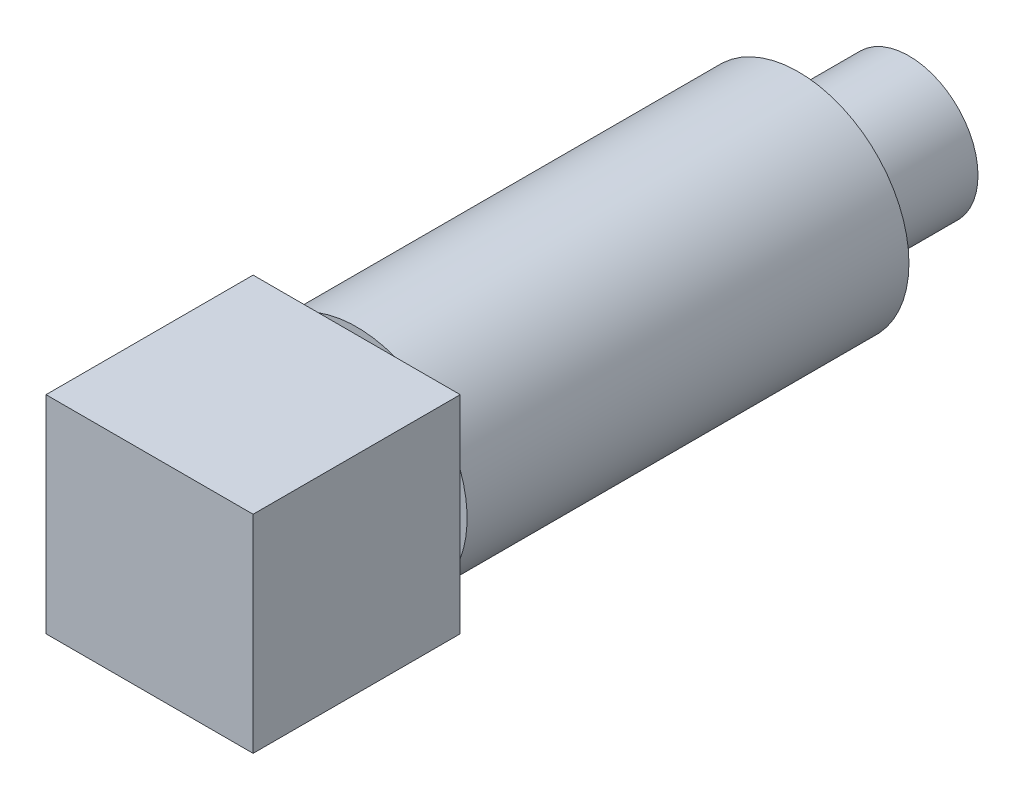
ISO-10303-21;
HEADER;
FILE_DESCRIPTION(('STEP AP214'),'2;1');
FILE_NAME('part.step','',(''),(''),'','','');
FILE_SCHEMA(('AUTOMOTIVE_DESIGN { 1 0 10303 214 1 1 1 1 }'));
ENDSEC;
DATA;
#1=APPLICATION_CONTEXT('core data for automotive mechanical design processes');
#2=APPLICATION_PROTOCOL_DEFINITION('international standard','automotive_design',2000,#1);
#3=PRODUCT_CONTEXT('',#1,'mechanical');
#4=PRODUCT('Part','Part','',(#3));
#5=PRODUCT_RELATED_PRODUCT_CATEGORY('part','',(#4));
#6=PRODUCT_DEFINITION_FORMATION('','',#4);
#7=PRODUCT_DEFINITION_CONTEXT('part definition',#1,'design');
#8=PRODUCT_DEFINITION('design','',#6,#7);
#9=PRODUCT_DEFINITION_SHAPE('','',#8);
#10=(LENGTH_UNIT() NAMED_UNIT(*) SI_UNIT(.MILLI.,.METRE.));
#11=(NAMED_UNIT(*) PLANE_ANGLE_UNIT() SI_UNIT($,.RADIAN.));
#12=(NAMED_UNIT(*) SI_UNIT($,.STERADIAN.) SOLID_ANGLE_UNIT());
#13=UNCERTAINTY_MEASURE_WITH_UNIT(LENGTH_MEASURE(1.E-05),#10,'distance_accuracy_value','');
#14=(GEOMETRIC_REPRESENTATION_CONTEXT(3) GLOBAL_UNCERTAINTY_ASSIGNED_CONTEXT((#13)) GLOBAL_UNIT_ASSIGNED_CONTEXT((#10,
#11,#12)) REPRESENTATION_CONTEXT('',''));
#15=CARTESIAN_POINT('',(0.,0.,0.));
#16=DIRECTION('',(0.,0.,1.));
#17=DIRECTION('',(1.,0.,0.));
#18=AXIS2_PLACEMENT_3D('',#15,#16,#17);
#19=CARTESIAN_POINT('',(0.,0.,40.));
#20=DIRECTION('',(0.,0.,1.));
#21=DIRECTION('',(1.,0.,0.));
#22=AXIS2_PLACEMENT_3D('',#19,#20,#21);
#23=PLANE('',#22);
#24=DIRECTION('',(0.,-1.,0.));
#25=VECTOR('',#24,1.);
#26=CARTESIAN_POINT('',(-7.5,7.5,40.));
#27=LINE('',#26,#25);
#28=CARTESIAN_POINT('',(-7.5,2.78388218141501,40.));
#29=VERTEX_POINT('',#28);
#30=CARTESIAN_POINT('',(-7.5,-2.78388218141501,40.));
#31=VERTEX_POINT('',#30);
#32=EDGE_CURVE('E11',#29,#31,#27,.T.);
#33=ORIENTED_EDGE('',*,*,#32,.F.);
#34=CARTESIAN_POINT('',(0.,0.,40.));
#35=DIRECTION('',(0.,0.,1.));
#36=DIRECTION('',(1.,0.,0.));
#37=AXIS2_PLACEMENT_3D('',#34,#35,#36);
#38=CIRCLE('',#37,8.);
#39=EDGE_CURVE('E361',#29,#31,#38,.T.);
#40=ORIENTED_EDGE('',*,*,#39,.T.);
#41=EDGE_LOOP('',(#33,#40));
#42=FACE_BOUND('',#41,.T.);
#43=ADVANCED_FACE('F41',(#42),#23,.T.);
#44=DIRECTION('',(-1.,0.,0.));
#45=VECTOR('',#44,1.);
#46=CARTESIAN_POINT('',(7.5,7.5,40.));
#47=LINE('',#46,#45);
#48=CARTESIAN_POINT('',(2.78388218141501,7.5,40.));
#49=VERTEX_POINT('',#48);
#50=CARTESIAN_POINT('',(-2.78388218141501,7.5,40.));
#51=VERTEX_POINT('',#50);
#52=EDGE_CURVE('E50',#49,#51,#47,.T.);
#53=ORIENTED_EDGE('',*,*,#52,.F.);
#54=EDGE_CURVE('E147',#49,#51,#38,.T.);
#55=ORIENTED_EDGE('',*,*,#54,.T.);
#56=EDGE_LOOP('',(#53,#55));
#57=FACE_BOUND('',#56,.T.);
#58=ADVANCED_FACE('F172',(#57),#23,.T.);
#59=DIRECTION('',(0.,1.,0.));
#60=VECTOR('',#59,1.);
#61=CARTESIAN_POINT('',(7.5,7.5,40.));
#62=LINE('',#61,#60);
#63=CARTESIAN_POINT('',(7.5,-2.78388218141501,40.));
#64=VERTEX_POINT('',#63);
#65=CARTESIAN_POINT('',(7.5,2.78388218141501,40.));
#66=VERTEX_POINT('',#65);
#67=EDGE_CURVE('E59',#64,#66,#62,.T.);
#68=ORIENTED_EDGE('',*,*,#67,.F.);
#69=EDGE_CURVE('E139',#64,#66,#38,.T.);
#70=ORIENTED_EDGE('',*,*,#69,.T.);
#71=EDGE_LOOP('',(#68,#70));
#72=FACE_BOUND('',#71,.T.);
#73=ADVANCED_FACE('F169',(#72),#23,.T.);
#74=CARTESIAN_POINT('',(0.,0.,8.));
#75=DIRECTION('',(0.,0.,-1.));
#76=DIRECTION('',(-1.,0.,0.));
#77=AXIS2_PLACEMENT_3D('',#74,#75,#76);
#78=CYLINDRICAL_SURFACE('',#77,5.);
#79=CARTESIAN_POINT('',(0.,0.,8.));
#80=DIRECTION('',(0.,0.,1.));
#81=DIRECTION('',(1.,0.,0.));
#82=AXIS2_PLACEMENT_3D('',#79,#80,#81);
#83=CIRCLE('',#82,5.);
#84=CARTESIAN_POINT('',(5.,0.,8.));
#85=VERTEX_POINT('',#84);
#86=EDGE_CURVE('E148',#85,#85,#83,.T.);
#87=ORIENTED_EDGE('',*,*,#86,.F.);
#88=EDGE_LOOP('',(#87));
#89=FACE_BOUND('',#88,.T.);
#90=CARTESIAN_POINT('',(0.,0.,0.));
#91=DIRECTION('',(0.,0.,1.));
#92=DIRECTION('',(1.,0.,0.));
#93=AXIS2_PLACEMENT_3D('',#90,#91,#92);
#94=CIRCLE('',#93,5.);
#95=CARTESIAN_POINT('',(5.,0.,0.));
#96=VERTEX_POINT('',#95);
#97=EDGE_CURVE('E45',#96,#96,#94,.T.);
#98=ORIENTED_EDGE('',*,*,#97,.T.);
#99=EDGE_LOOP('',(#98));
#100=FACE_BOUND('',#99,.T.);
#101=ADVANCED_FACE('F43',(#89,#100),#78,.T.);
#102=CARTESIAN_POINT('',(0.,0.,0.));
#103=DIRECTION('',(0.,0.,1.));
#104=DIRECTION('',(1.,0.,0.));
#105=AXIS2_PLACEMENT_3D('',#102,#103,#104);
#106=PLANE('',#105);
#107=ORIENTED_EDGE('',*,*,#97,.F.);
#108=EDGE_LOOP('',(#107));
#109=FACE_BOUND('',#108,.T.);
#110=ADVANCED_FACE('F159',(#109),#106,.F.);
#111=CARTESIAN_POINT('',(0.,0.,40.));
#112=DIRECTION('',(0.,0.,-1.));
#113=DIRECTION('',(-1.,0.,0.));
#114=AXIS2_PLACEMENT_3D('',#111,#112,#113);
#115=CYLINDRICAL_SURFACE('',#114,8.);
#116=EDGE_CURVE('E145',#66,#49,#38,.T.);
#117=ORIENTED_EDGE('',*,*,#116,.F.);
#118=ORIENTED_EDGE('',*,*,#69,.F.);
#119=CARTESIAN_POINT('',(2.78388218141502,-7.5,40.));
#120=VERTEX_POINT('',#119);
#121=EDGE_CURVE('E336',#120,#64,#38,.T.);
#122=ORIENTED_EDGE('',*,*,#121,.F.);
#123=CARTESIAN_POINT('',(-2.78388218141501,-7.5,40.));
#124=VERTEX_POINT('',#123);
#125=EDGE_CURVE('E365',#124,#120,#38,.T.);
#126=ORIENTED_EDGE('',*,*,#125,.F.);
#127=EDGE_CURVE('E364',#31,#124,#38,.T.);
#128=ORIENTED_EDGE('',*,*,#127,.F.);
#129=ORIENTED_EDGE('',*,*,#39,.F.);
#130=EDGE_CURVE('E359',#51,#29,#38,.T.);
#131=ORIENTED_EDGE('',*,*,#130,.F.);
#132=ORIENTED_EDGE('',*,*,#54,.F.);
#133=EDGE_LOOP('',(#117,#118,#122,#126,#128,#129,#131,#132));
#134=FACE_BOUND('',#133,.T.);
#135=CARTESIAN_POINT('',(0.,0.,8.));
#136=DIRECTION('',(0.,0.,1.));
#137=DIRECTION('',(1.,0.,0.));
#138=AXIS2_PLACEMENT_3D('',#135,#136,#137);
#139=CIRCLE('',#138,8.);
#140=CARTESIAN_POINT('',(8.,0.,8.));
#141=VERTEX_POINT('',#140);
#142=EDGE_CURVE('E136',#141,#141,#139,.T.);
#143=ORIENTED_EDGE('',*,*,#142,.T.);
#144=EDGE_LOOP('',(#143));
#145=FACE_BOUND('',#144,.T.);
#146=ADVANCED_FACE('F161',(#134,#145),#115,.T.);
#147=DIRECTION('',(1.,0.,0.));
#148=VECTOR('',#147,1.);
#149=CARTESIAN_POINT('',(7.5,-7.5,40.));
#150=LINE('',#149,#148);
#151=EDGE_CURVE('E66',#124,#120,#150,.T.);
#152=ORIENTED_EDGE('',*,*,#151,.F.);
#153=ORIENTED_EDGE('',*,*,#125,.T.);
#154=EDGE_LOOP('',(#152,#153));
#155=FACE_BOUND('',#154,.T.);
#156=ADVANCED_FACE('F166',(#155),#23,.T.);
#157=CARTESIAN_POINT('',(0.,0.,8.));
#158=DIRECTION('',(0.,0.,1.));
#159=DIRECTION('',(1.,0.,0.));
#160=AXIS2_PLACEMENT_3D('',#157,#158,#159);
#161=PLANE('',#160);
#162=ORIENTED_EDGE('',*,*,#86,.T.);
#163=EDGE_LOOP('',(#162));
#164=FACE_BOUND('',#163,.T.);
#165=ORIENTED_EDGE('',*,*,#142,.F.);
#166=EDGE_LOOP('',(#165));
#167=FACE_BOUND('',#166,.T.);
#168=ADVANCED_FACE('F182',(#164,#167),#161,.F.);
#169=CARTESIAN_POINT('',(0.,0.,40.));
#170=DIRECTION('',(0.,0.,-1.));
#171=DIRECTION('',(-1.,0.,0.));
#172=AXIS2_PLACEMENT_3D('',#169,#170,#171);
#173=PLANE('',#172);
#174=CARTESIAN_POINT('',(7.5,7.5,40.));
#175=VERTEX_POINT('',#174);
#176=EDGE_CURVE('E340',#66,#175,#62,.T.);
#177=ORIENTED_EDGE('',*,*,#176,.F.);
#178=ORIENTED_EDGE('',*,*,#116,.T.);
#179=EDGE_CURVE('E130',#175,#49,#47,.T.);
#180=ORIENTED_EDGE('',*,*,#179,.F.);
#181=EDGE_LOOP('',(#177,#178,#180));
#182=FACE_BOUND('',#181,.T.);
#183=ADVANCED_FACE('F186',(#182),#173,.T.);
#184=CARTESIAN_POINT('',(-7.5,7.5,40.));
#185=VERTEX_POINT('',#184);
#186=EDGE_CURVE('E344',#51,#185,#47,.T.);
#187=ORIENTED_EDGE('',*,*,#186,.F.);
#188=ORIENTED_EDGE('',*,*,#130,.T.);
#189=EDGE_CURVE('E52',#185,#29,#27,.T.);
#190=ORIENTED_EDGE('',*,*,#189,.F.);
#191=EDGE_LOOP('',(#187,#188,#190));
#192=FACE_BOUND('',#191,.T.);
#193=ADVANCED_FACE('F241',(#192),#173,.T.);
#194=CARTESIAN_POINT('',(-7.5,-7.5,40.));
#195=VERTEX_POINT('',#194);
#196=EDGE_CURVE('E53',#31,#195,#27,.T.);
#197=ORIENTED_EDGE('',*,*,#196,.F.);
#198=ORIENTED_EDGE('',*,*,#127,.T.);
#199=EDGE_CURVE('E153',#195,#124,#150,.T.);
#200=ORIENTED_EDGE('',*,*,#199,.F.);
#201=EDGE_LOOP('',(#197,#198,#200));
#202=FACE_BOUND('',#201,.T.);
#203=ADVANCED_FACE('F253',(#202),#173,.T.);
#204=CARTESIAN_POINT('',(-7.5,7.5,55.));
#205=DIRECTION('',(1.,0.,0.));
#206=DIRECTION('',(0.,1.,0.));
#207=AXIS2_PLACEMENT_3D('',#204,#205,#206);
#208=PLANE('',#207);
#209=ORIENTED_EDGE('',*,*,#189,.T.);
#210=ORIENTED_EDGE('',*,*,#32,.T.);
#211=ORIENTED_EDGE('',*,*,#196,.T.);
#212=DIRECTION('',(0.,0.,-1.));
#213=VECTOR('',#212,1.);
#214=CARTESIAN_POINT('',(-7.5,-7.5,55.));
#215=LINE('',#214,#213);
#216=CARTESIAN_POINT('',(-7.5,-7.5,55.));
#217=VERTEX_POINT('',#216);
#218=EDGE_CURVE('E115',#217,#195,#215,.T.);
#219=ORIENTED_EDGE('',*,*,#218,.F.);
#220=DIRECTION('',(0.,-1.,0.));
#221=VECTOR('',#220,1.);
#222=CARTESIAN_POINT('',(-7.5,7.5,55.));
#223=LINE('',#222,#221);
#224=CARTESIAN_POINT('',(-7.5,7.5,55.));
#225=VERTEX_POINT('',#224);
#226=EDGE_CURVE('E121',#225,#217,#223,.T.);
#227=ORIENTED_EDGE('',*,*,#226,.F.);
#228=DIRECTION('',(0.,0.,-1.));
#229=VECTOR('',#228,1.);
#230=CARTESIAN_POINT('',(-7.5,7.5,55.));
#231=LINE('',#230,#229);
#232=EDGE_CURVE('E347',#225,#185,#231,.T.);
#233=ORIENTED_EDGE('',*,*,#232,.T.);
#234=EDGE_LOOP('',(#209,#210,#211,#219,#227,#233));
#235=FACE_BOUND('',#234,.T.);
#236=ADVANCED_FACE('F133',(#235),#208,.F.);
#237=CARTESIAN_POINT('',(7.5,-7.5,55.));
#238=DIRECTION('',(0.,1.,0.));
#239=DIRECTION('',(-1.,0.,0.));
#240=AXIS2_PLACEMENT_3D('',#237,#238,#239);
#241=PLANE('',#240);
#242=ORIENTED_EDGE('',*,*,#199,.T.);
#243=ORIENTED_EDGE('',*,*,#151,.T.);
#244=CARTESIAN_POINT('',(7.5,-7.5,40.));
#245=VERTEX_POINT('',#244);
#246=EDGE_CURVE('E154',#120,#245,#150,.T.);
#247=ORIENTED_EDGE('',*,*,#246,.T.);
#248=DIRECTION('',(0.,0.,-1.));
#249=VECTOR('',#248,1.);
#250=CARTESIAN_POINT('',(7.5,-7.5,55.));
#251=LINE('',#250,#249);
#252=CARTESIAN_POINT('',(7.5,-7.5,55.));
#253=VERTEX_POINT('',#252);
#254=EDGE_CURVE('E117',#253,#245,#251,.T.);
#255=ORIENTED_EDGE('',*,*,#254,.F.);
#256=DIRECTION('',(1.,0.,0.));
#257=VECTOR('',#256,1.);
#258=CARTESIAN_POINT('',(7.5,-7.5,55.));
#259=LINE('',#258,#257);
#260=EDGE_CURVE('E110',#217,#253,#259,.T.);
#261=ORIENTED_EDGE('',*,*,#260,.F.);
#262=ORIENTED_EDGE('',*,*,#218,.T.);
#263=EDGE_LOOP('',(#242,#243,#247,#255,#261,#262));
#264=FACE_BOUND('',#263,.T.);
#265=ADVANCED_FACE('F113',(#264),#241,.F.);
#266=CARTESIAN_POINT('',(7.5,7.5,55.));
#267=DIRECTION('',(-1.,0.,0.));
#268=DIRECTION('',(0.,-1.,0.));
#269=AXIS2_PLACEMENT_3D('',#266,#267,#268);
#270=PLANE('',#269);
#271=EDGE_CURVE('E338',#245,#64,#62,.T.);
#272=ORIENTED_EDGE('',*,*,#271,.T.);
#273=ORIENTED_EDGE('',*,*,#67,.T.);
#274=ORIENTED_EDGE('',*,*,#176,.T.);
#275=DIRECTION('',(0.,0.,-1.));
#276=VECTOR('',#275,1.);
#277=CARTESIAN_POINT('',(7.5,7.5,55.));
#278=LINE('',#277,#276);
#279=CARTESIAN_POINT('',(7.5,7.5,55.));
#280=VERTEX_POINT('',#279);
#281=EDGE_CURVE('E141',#280,#175,#278,.T.);
#282=ORIENTED_EDGE('',*,*,#281,.F.);
#283=DIRECTION('',(0.,1.,0.));
#284=VECTOR('',#283,1.);
#285=CARTESIAN_POINT('',(7.5,7.5,55.));
#286=LINE('',#285,#284);
#287=EDGE_CURVE('E120',#253,#280,#286,.T.);
#288=ORIENTED_EDGE('',*,*,#287,.F.);
#289=ORIENTED_EDGE('',*,*,#254,.T.);
#290=EDGE_LOOP('',(#272,#273,#274,#282,#288,#289));
#291=FACE_BOUND('',#290,.T.);
#292=ADVANCED_FACE('F280',(#291),#270,.F.);
#293=CARTESIAN_POINT('',(7.5,7.5,55.));
#294=DIRECTION('',(0.,-1.,0.));
#295=DIRECTION('',(1.,0.,0.));
#296=AXIS2_PLACEMENT_3D('',#293,#294,#295);
#297=PLANE('',#296);
#298=ORIENTED_EDGE('',*,*,#179,.T.);
#299=ORIENTED_EDGE('',*,*,#52,.T.);
#300=ORIENTED_EDGE('',*,*,#186,.T.);
#301=ORIENTED_EDGE('',*,*,#232,.F.);
#302=DIRECTION('',(-1.,0.,0.));
#303=VECTOR('',#302,1.);
#304=CARTESIAN_POINT('',(7.5,7.5,55.));
#305=LINE('',#304,#303);
#306=EDGE_CURVE('E126',#280,#225,#305,.T.);
#307=ORIENTED_EDGE('',*,*,#306,.F.);
#308=ORIENTED_EDGE('',*,*,#281,.T.);
#309=EDGE_LOOP('',(#298,#299,#300,#301,#307,#308));
#310=FACE_BOUND('',#309,.T.);
#311=ADVANCED_FACE('F290',(#310),#297,.F.);
#312=CARTESIAN_POINT('',(0.,0.,55.));
#313=DIRECTION('',(0.,0.,-1.));
#314=DIRECTION('',(-1.,0.,0.));
#315=AXIS2_PLACEMENT_3D('',#312,#313,#314);
#316=PLANE('',#315);
#317=ORIENTED_EDGE('',*,*,#226,.T.);
#318=ORIENTED_EDGE('',*,*,#260,.T.);
#319=ORIENTED_EDGE('',*,*,#287,.T.);
#320=ORIENTED_EDGE('',*,*,#306,.T.);
#321=EDGE_LOOP('',(#317,#318,#319,#320));
#322=FACE_BOUND('',#321,.T.);
#323=ADVANCED_FACE('F124',(#322),#316,.F.);
#324=ORIENTED_EDGE('',*,*,#246,.F.);
#325=ORIENTED_EDGE('',*,*,#121,.T.);
#326=ORIENTED_EDGE('',*,*,#271,.F.);
#327=EDGE_LOOP('',(#324,#325,#326));
#328=FACE_BOUND('',#327,.T.);
#329=ADVANCED_FACE('F244',(#328),#173,.T.);
#330=CLOSED_SHELL('',(#43,#58,#73,#101,#110,#146,#156,#168,#183,#193,#203,#236,#265,#292,#311,
#323,#329));
#331=MANIFOLD_SOLID_BREP('B2',#330);
#332=ADVANCED_BREP_SHAPE_REPRESENTATION('',(#18,#331),#14);
#333=SHAPE_DEFINITION_REPRESENTATION(#9,#332);
ENDSEC;
END-ISO-10303-21;
